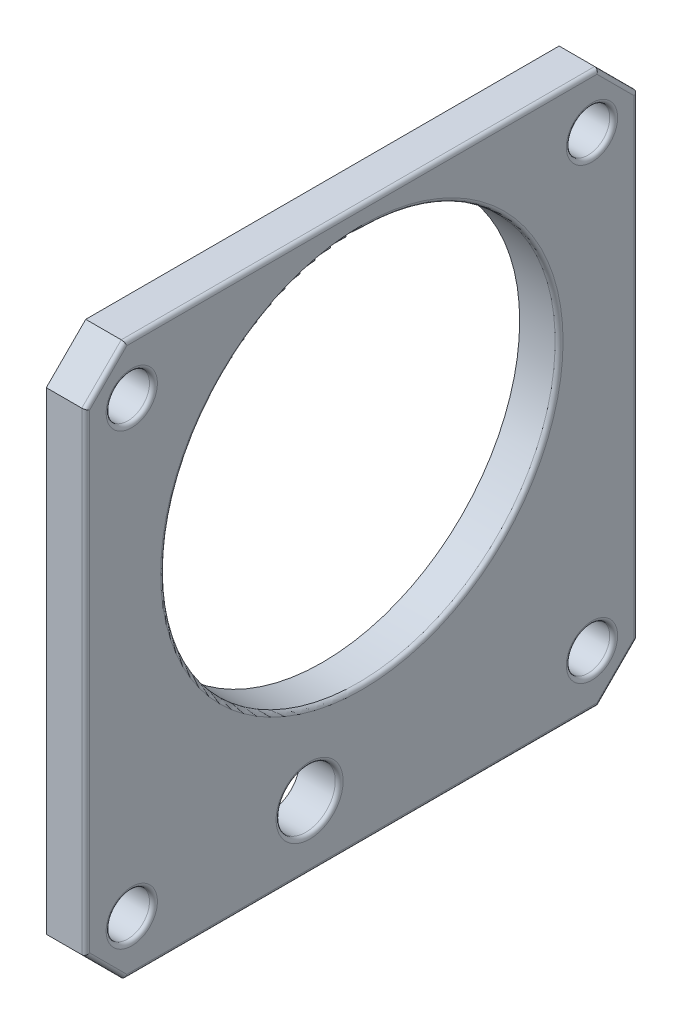
ISO-10303-21;
HEADER;
FILE_DESCRIPTION(('STEP AP214'),'2;1');
FILE_NAME('part.step','',(''),(''),'','','');
FILE_SCHEMA(('AUTOMOTIVE_DESIGN { 1 0 10303 214 1 1 1 1 }'));
ENDSEC;
DATA;
#1=APPLICATION_CONTEXT('core data for automotive mechanical design processes');
#2=APPLICATION_PROTOCOL_DEFINITION('international standard','automotive_design',2000,#1);
#3=PRODUCT_CONTEXT('',#1,'mechanical');
#4=PRODUCT('Part','Part','',(#3));
#5=PRODUCT_RELATED_PRODUCT_CATEGORY('part','',(#4));
#6=PRODUCT_DEFINITION_FORMATION('','',#4);
#7=PRODUCT_DEFINITION_CONTEXT('part definition',#1,'design');
#8=PRODUCT_DEFINITION('design','',#6,#7);
#9=PRODUCT_DEFINITION_SHAPE('','',#8);
#10=(LENGTH_UNIT() NAMED_UNIT(*) SI_UNIT(.MILLI.,.METRE.));
#11=(NAMED_UNIT(*) PLANE_ANGLE_UNIT() SI_UNIT($,.RADIAN.));
#12=(NAMED_UNIT(*) SI_UNIT($,.STERADIAN.) SOLID_ANGLE_UNIT());
#13=UNCERTAINTY_MEASURE_WITH_UNIT(LENGTH_MEASURE(1.E-05),#10,'distance_accuracy_value','');
#14=(GEOMETRIC_REPRESENTATION_CONTEXT(3) GLOBAL_UNCERTAINTY_ASSIGNED_CONTEXT((#13)) GLOBAL_UNIT_ASSIGNED_CONTEXT((#10,
#11,#12)) REPRESENTATION_CONTEXT('',''));
#15=CARTESIAN_POINT('',(0.,0.,0.));
#16=DIRECTION('',(0.,0.,1.));
#17=DIRECTION('',(1.,0.,0.));
#18=AXIS2_PLACEMENT_3D('',#15,#16,#17);
#19=CARTESIAN_POINT('',(3.,0.,0.));
#20=DIRECTION('',(-1.,0.,0.));
#21=DIRECTION('',(0.,0.,1.));
#22=AXIS2_PLACEMENT_3D('',#19,#20,#21);
#23=PLANE('',#22);
#24=CARTESIAN_POINT('',(3.,4.40000000000001,0.));
#25=DIRECTION('',(-1.,0.,0.));
#26=DIRECTION('',(0.,0.,1.));
#27=AXIS2_PLACEMENT_3D('',#24,#25,#26);
#28=CIRCLE('',#27,15.3);
#29=CARTESIAN_POINT('',(3.,4.40000000000001,15.3));
#30=VERTEX_POINT('',#29);
#31=EDGE_CURVE('E230',#30,#30,#28,.T.);
#32=ORIENTED_EDGE('',*,*,#31,.T.);
#33=EDGE_LOOP('',(#32));
#34=FACE_BOUND('',#33,.T.);
#35=DIRECTION('',(0.,1.,0.));
#36=VECTOR('',#35,1.);
#37=CARTESIAN_POINT('',(3.,0.,-20.7));
#38=LINE('',#37,#36);
#39=CARTESIAN_POINT('',(3.,-17.8757359312881,-20.7));
#40=VERTEX_POINT('',#39);
#41=CARTESIAN_POINT('',(3.,17.8757359312881,-20.7));
#42=VERTEX_POINT('',#41);
#43=EDGE_CURVE('E225',#40,#42,#38,.T.);
#44=ORIENTED_EDGE('',*,*,#43,.T.);
#45=DIRECTION('',(0.,0.707106781186548,0.707106781186547));
#46=VECTOR('',#45,1.);
#47=CARTESIAN_POINT('',(3.,19.287867965644,-19.2878679656441));
#48=LINE('',#47,#46);
#49=CARTESIAN_POINT('',(3.,20.7,-17.8757359312881));
#50=VERTEX_POINT('',#49);
#51=EDGE_CURVE('E227',#42,#50,#48,.T.);
#52=ORIENTED_EDGE('',*,*,#51,.T.);
#53=DIRECTION('',(0.,0.,1.));
#54=VECTOR('',#53,1.);
#55=CARTESIAN_POINT('',(3.,20.7,0.));
#56=LINE('',#55,#54);
#57=CARTESIAN_POINT('',(3.,20.7,17.8757359312881));
#58=VERTEX_POINT('',#57);
#59=EDGE_CURVE('E213',#50,#58,#56,.T.);
#60=ORIENTED_EDGE('',*,*,#59,.T.);
#61=DIRECTION('',(0.,-0.707106781186548,0.707106781186548));
#62=VECTOR('',#61,1.);
#63=CARTESIAN_POINT('',(3.,19.287867965644,19.287867965644));
#64=LINE('',#63,#62);
#65=CARTESIAN_POINT('',(3.,17.8757359312881,20.7));
#66=VERTEX_POINT('',#65);
#67=EDGE_CURVE('E215',#58,#66,#64,.T.);
#68=ORIENTED_EDGE('',*,*,#67,.T.);
#69=DIRECTION('',(0.,-1.,0.));
#70=VECTOR('',#69,1.);
#71=CARTESIAN_POINT('',(3.,0.,20.7));
#72=LINE('',#71,#70);
#73=CARTESIAN_POINT('',(3.,-17.8757359312881,20.7));
#74=VERTEX_POINT('',#73);
#75=EDGE_CURVE('E217',#66,#74,#72,.T.);
#76=ORIENTED_EDGE('',*,*,#75,.T.);
#77=DIRECTION('',(0.,-0.707106781186548,-0.707106781186547));
#78=VECTOR('',#77,1.);
#79=CARTESIAN_POINT('',(3.,-19.287867965644,19.2878679656441));
#80=LINE('',#79,#78);
#81=CARTESIAN_POINT('',(3.,-20.7,17.8757359312881));
#82=VERTEX_POINT('',#81);
#83=EDGE_CURVE('E219',#74,#82,#80,.T.);
#84=ORIENTED_EDGE('',*,*,#83,.T.);
#85=DIRECTION('',(0.,0.,-1.));
#86=VECTOR('',#85,1.);
#87=CARTESIAN_POINT('',(3.,-20.7,0.));
#88=LINE('',#87,#86);
#89=CARTESIAN_POINT('',(3.,-20.7,-17.8757359312881));
#90=VERTEX_POINT('',#89);
#91=EDGE_CURVE('E221',#82,#90,#88,.T.);
#92=ORIENTED_EDGE('',*,*,#91,.T.);
#93=DIRECTION('',(0.,0.707106781186548,-0.707106781186548));
#94=VECTOR('',#93,1.);
#95=CARTESIAN_POINT('',(3.,-19.287867965644,-19.287867965644));
#96=LINE('',#95,#94);
#97=EDGE_CURVE('E223',#90,#40,#96,.T.);
#98=ORIENTED_EDGE('',*,*,#97,.T.);
#99=EDGE_LOOP('',(#44,#52,#60,#68,#76,#84,#92,#98));
#100=FACE_BOUND('',#99,.T.);
#101=CARTESIAN_POINT('',(3.,-17.0620447832832,-17.4995034759885));
#102=DIRECTION('',(-1.,0.,0.));
#103=DIRECTION('',(0.,0.,1.));
#104=AXIS2_PLACEMENT_3D('',#101,#102,#103);
#105=CIRCLE('',#104,1.95);
#106=CARTESIAN_POINT('',(3.,-17.0620447832832,-15.5495034759885));
#107=VERTEX_POINT('',#106);
#108=EDGE_CURVE('E210',#107,#107,#105,.T.);
#109=ORIENTED_EDGE('',*,*,#108,.T.);
#110=EDGE_LOOP('',(#109));
#111=FACE_BOUND('',#110,.T.);
#112=CARTESIAN_POINT('',(3.,17.0620447832832,17.4995034759885));
#113=DIRECTION('',(-1.,0.,0.));
#114=DIRECTION('',(0.,0.,1.));
#115=AXIS2_PLACEMENT_3D('',#112,#113,#114);
#116=CIRCLE('',#115,1.95);
#117=CARTESIAN_POINT('',(3.,17.0620447832832,19.4495034759885));
#118=VERTEX_POINT('',#117);
#119=EDGE_CURVE('E207',#118,#118,#116,.T.);
#120=ORIENTED_EDGE('',*,*,#119,.T.);
#121=EDGE_LOOP('',(#120));
#122=FACE_BOUND('',#121,.T.);
#123=CARTESIAN_POINT('',(3.,17.0620447832832,-17.4995034759885));
#124=DIRECTION('',(-1.,0.,0.));
#125=DIRECTION('',(0.,0.,1.));
#126=AXIS2_PLACEMENT_3D('',#123,#124,#125);
#127=CIRCLE('',#126,1.95);
#128=CARTESIAN_POINT('',(3.,17.0620447832832,-15.5495034759885));
#129=VERTEX_POINT('',#128);
#130=EDGE_CURVE('E204',#129,#129,#127,.T.);
#131=ORIENTED_EDGE('',*,*,#130,.T.);
#132=EDGE_LOOP('',(#131));
#133=FACE_BOUND('',#132,.T.);
#134=CARTESIAN_POINT('',(3.,-17.0620447832832,17.4995034759885));
#135=DIRECTION('',(-1.,0.,0.));
#136=DIRECTION('',(0.,0.,1.));
#137=AXIS2_PLACEMENT_3D('',#134,#135,#136);
#138=CIRCLE('',#137,1.95);
#139=CARTESIAN_POINT('',(3.,-17.0620447832832,19.4495034759885));
#140=VERTEX_POINT('',#139);
#141=EDGE_CURVE('E201',#140,#140,#138,.T.);
#142=ORIENTED_EDGE('',*,*,#141,.T.);
#143=EDGE_LOOP('',(#142));
#144=FACE_BOUND('',#143,.T.);
#145=CARTESIAN_POINT('',(3.,-16.2,3.97497152615893));
#146=DIRECTION('',(-1.,0.,0.));
#147=DIRECTION('',(0.,0.,1.));
#148=AXIS2_PLACEMENT_3D('',#145,#146,#147);
#149=CIRCLE('',#148,2.55);
#150=CARTESIAN_POINT('',(3.,-16.2,6.52497152615894));
#151=VERTEX_POINT('',#150);
#152=EDGE_CURVE('E198',#151,#151,#149,.T.);
#153=ORIENTED_EDGE('',*,*,#152,.T.);
#154=EDGE_LOOP('',(#153));
#155=FACE_BOUND('',#154,.T.);
#156=ADVANCED_FACE('F35',(#34,#100,#111,#122,#133,#144,#155),#23,.F.);
#157=CARTESIAN_POINT('',(0.,0.,0.));
#158=DIRECTION('',(-1.,0.,0.));
#159=DIRECTION('',(0.,0.,1.));
#160=AXIS2_PLACEMENT_3D('',#157,#158,#159);
#161=PLANE('',#160);
#162=CARTESIAN_POINT('',(0.,-16.2,3.97497152615893));
#163=DIRECTION('',(-1.,0.,0.));
#164=DIRECTION('',(0.,0.,1.));
#165=AXIS2_PLACEMENT_3D('',#162,#163,#164);
#166=CIRCLE('',#165,2.25);
#167=CARTESIAN_POINT('',(0.,-16.2,6.22497152615894));
#168=VERTEX_POINT('',#167);
#169=EDGE_CURVE('E188',#168,#168,#166,.T.);
#170=ORIENTED_EDGE('',*,*,#169,.F.);
#171=EDGE_LOOP('',(#170));
#172=FACE_BOUND('',#171,.T.);
#173=CARTESIAN_POINT('',(0.,-17.0620447832832,17.4995034759885));
#174=DIRECTION('',(-1.,0.,0.));
#175=DIRECTION('',(0.,0.,1.));
#176=AXIS2_PLACEMENT_3D('',#173,#174,#175);
#177=CIRCLE('',#176,1.65);
#178=CARTESIAN_POINT('',(0.,-17.0620447832832,19.1495034759885));
#179=VERTEX_POINT('',#178);
#180=EDGE_CURVE('E153',#179,#179,#177,.T.);
#181=ORIENTED_EDGE('',*,*,#180,.F.);
#182=EDGE_LOOP('',(#181));
#183=FACE_BOUND('',#182,.T.);
#184=CARTESIAN_POINT('',(0.,17.0620447832832,-17.4995034759885));
#185=DIRECTION('',(-1.,0.,0.));
#186=DIRECTION('',(0.,0.,1.));
#187=AXIS2_PLACEMENT_3D('',#184,#185,#186);
#188=CIRCLE('',#187,1.65);
#189=CARTESIAN_POINT('',(0.,17.0620447832832,-15.8495034759885));
#190=VERTEX_POINT('',#189);
#191=EDGE_CURVE('E191',#190,#190,#188,.T.);
#192=ORIENTED_EDGE('',*,*,#191,.F.);
#193=EDGE_LOOP('',(#192));
#194=FACE_BOUND('',#193,.T.);
#195=CARTESIAN_POINT('',(0.,17.0620447832832,17.4995034759885));
#196=DIRECTION('',(-1.,0.,0.));
#197=DIRECTION('',(0.,0.,1.));
#198=AXIS2_PLACEMENT_3D('',#195,#196,#197);
#199=CIRCLE('',#198,1.65);
#200=CARTESIAN_POINT('',(0.,17.0620447832832,19.1495034759885));
#201=VERTEX_POINT('',#200);
#202=EDGE_CURVE('E187',#201,#201,#199,.T.);
#203=ORIENTED_EDGE('',*,*,#202,.F.);
#204=EDGE_LOOP('',(#203));
#205=FACE_BOUND('',#204,.T.);
#206=CARTESIAN_POINT('',(0.,-17.0620447832832,-17.4995034759885));
#207=DIRECTION('',(-1.,0.,0.));
#208=DIRECTION('',(0.,0.,1.));
#209=AXIS2_PLACEMENT_3D('',#206,#207,#208);
#210=CIRCLE('',#209,1.65);
#211=CARTESIAN_POINT('',(0.,-17.0620447832832,-15.8495034759885));
#212=VERTEX_POINT('',#211);
#213=EDGE_CURVE('E184',#212,#212,#210,.T.);
#214=ORIENTED_EDGE('',*,*,#213,.F.);
#215=EDGE_LOOP('',(#214));
#216=FACE_BOUND('',#215,.T.);
#217=DIRECTION('',(0.,0.,1.));
#218=VECTOR('',#217,1.);
#219=CARTESIAN_POINT('',(0.,21.,18.));
#220=LINE('',#219,#218);
#221=CARTESIAN_POINT('',(0.,21.,-18.));
#222=VERTEX_POINT('',#221);
#223=CARTESIAN_POINT('',(0.,21.,18.));
#224=VERTEX_POINT('',#223);
#225=EDGE_CURVE('E141',#222,#224,#220,.T.);
#226=ORIENTED_EDGE('',*,*,#225,.F.);
#227=DIRECTION('',(0.,0.707106781186548,0.707106781186547));
#228=VECTOR('',#227,1.);
#229=CARTESIAN_POINT('',(0.,21.,-18.));
#230=LINE('',#229,#228);
#231=CARTESIAN_POINT('',(0.,18.,-21.));
#232=VERTEX_POINT('',#231);
#233=EDGE_CURVE('E170',#232,#222,#230,.T.);
#234=ORIENTED_EDGE('',*,*,#233,.F.);
#235=DIRECTION('',(0.,1.,0.));
#236=VECTOR('',#235,1.);
#237=CARTESIAN_POINT('',(0.,18.,-21.));
#238=LINE('',#237,#236);
#239=CARTESIAN_POINT('',(0.,-18.,-21.));
#240=VERTEX_POINT('',#239);
#241=EDGE_CURVE('E167',#240,#232,#238,.T.);
#242=ORIENTED_EDGE('',*,*,#241,.F.);
#243=DIRECTION('',(0.,0.707106781186548,-0.707106781186548));
#244=VECTOR('',#243,1.);
#245=CARTESIAN_POINT('',(0.,-21.,-18.));
#246=LINE('',#245,#244);
#247=CARTESIAN_POINT('',(0.,-21.,-18.));
#248=VERTEX_POINT('',#247);
#249=EDGE_CURVE('E164',#248,#240,#246,.T.);
#250=ORIENTED_EDGE('',*,*,#249,.F.);
#251=DIRECTION('',(0.,0.,-1.));
#252=VECTOR('',#251,1.);
#253=CARTESIAN_POINT('',(0.,-21.,18.));
#254=LINE('',#253,#252);
#255=CARTESIAN_POINT('',(0.,-21.,18.));
#256=VERTEX_POINT('',#255);
#257=EDGE_CURVE('E161',#256,#248,#254,.T.);
#258=ORIENTED_EDGE('',*,*,#257,.F.);
#259=DIRECTION('',(0.,-0.707106781186548,-0.707106781186547));
#260=VECTOR('',#259,1.);
#261=CARTESIAN_POINT('',(0.,-18.,21.));
#262=LINE('',#261,#260);
#263=CARTESIAN_POINT('',(0.,-18.,21.));
#264=VERTEX_POINT('',#263);
#265=EDGE_CURVE('E158',#264,#256,#262,.T.);
#266=ORIENTED_EDGE('',*,*,#265,.F.);
#267=DIRECTION('',(0.,-1.,0.));
#268=VECTOR('',#267,1.);
#269=CARTESIAN_POINT('',(0.,18.,21.));
#270=LINE('',#269,#268);
#271=CARTESIAN_POINT('',(0.,18.,21.));
#272=VERTEX_POINT('',#271);
#273=EDGE_CURVE('E144',#272,#264,#270,.T.);
#274=ORIENTED_EDGE('',*,*,#273,.F.);
#275=DIRECTION('',(0.,-0.707106781186548,0.707106781186548));
#276=VECTOR('',#275,1.);
#277=CARTESIAN_POINT('',(0.,18.,21.));
#278=LINE('',#277,#276);
#279=EDGE_CURVE('E128',#224,#272,#278,.T.);
#280=ORIENTED_EDGE('',*,*,#279,.F.);
#281=EDGE_LOOP('',(#226,#234,#242,#250,#258,#266,#274,#280));
#282=FACE_BOUND('',#281,.T.);
#283=CARTESIAN_POINT('',(0.,4.40000000000001,0.));
#284=DIRECTION('',(1.,0.,0.));
#285=DIRECTION('',(0.,0.,-1.));
#286=AXIS2_PLACEMENT_3D('',#283,#284,#285);
#287=CIRCLE('',#286,15.);
#288=CARTESIAN_POINT('',(0.,4.40000000000001,-15.));
#289=VERTEX_POINT('',#288);
#290=EDGE_CURVE('E150',#289,#289,#287,.T.);
#291=ORIENTED_EDGE('',*,*,#290,.T.);
#292=EDGE_LOOP('',(#291));
#293=FACE_BOUND('',#292,.T.);
#294=ADVANCED_FACE('F138',(#172,#183,#194,#205,#216,#282,#293),#161,.T.);
#295=CARTESIAN_POINT('',(3.,21.,18.));
#296=DIRECTION('',(0.,-1.,0.));
#297=DIRECTION('',(0.,0.,-1.));
#298=AXIS2_PLACEMENT_3D('',#295,#296,#297);
#299=PLANE('',#298);
#300=DIRECTION('',(-1.,0.,0.));
#301=VECTOR('',#300,1.);
#302=CARTESIAN_POINT('',(3.,21.,18.));
#303=LINE('',#302,#301);
#304=CARTESIAN_POINT('',(2.7,21.,18.));
#305=VERTEX_POINT('',#304);
#306=EDGE_CURVE('E125',#305,#224,#303,.T.);
#307=ORIENTED_EDGE('',*,*,#306,.F.);
#308=DIRECTION('',(0.,0.,1.));
#309=VECTOR('',#308,1.);
#310=CARTESIAN_POINT('',(2.7,21.,18.));
#311=LINE('',#310,#309);
#312=CARTESIAN_POINT('',(2.7,21.,-18.));
#313=VERTEX_POINT('',#312);
#314=EDGE_CURVE('E246',#305,#313,#311,.F.);
#315=ORIENTED_EDGE('',*,*,#314,.T.);
#316=DIRECTION('',(-1.,0.,0.));
#317=VECTOR('',#316,1.);
#318=CARTESIAN_POINT('',(3.,21.,-18.));
#319=LINE('',#318,#317);
#320=EDGE_CURVE('E148',#313,#222,#319,.T.);
#321=ORIENTED_EDGE('',*,*,#320,.T.);
#322=ORIENTED_EDGE('',*,*,#225,.T.);
#323=EDGE_LOOP('',(#307,#315,#321,#322));
#324=FACE_BOUND('',#323,.T.);
#325=ADVANCED_FACE('F146',(#324),#299,.F.);
#326=CARTESIAN_POINT('',(3.,18.,21.));
#327=DIRECTION('',(0.,-0.707106781186547,-0.707106781186547));
#328=DIRECTION('',(0.,0.707106781186548,-0.707106781186548));
#329=AXIS2_PLACEMENT_3D('',#326,#327,#328);
#330=PLANE('',#329);
#331=DIRECTION('',(-1.,0.,0.));
#332=VECTOR('',#331,1.);
#333=CARTESIAN_POINT('',(3.,18.,21.));
#334=LINE('',#333,#332);
#335=CARTESIAN_POINT('',(2.7,18.,21.));
#336=VERTEX_POINT('',#335);
#337=EDGE_CURVE('E134',#336,#272,#334,.T.);
#338=ORIENTED_EDGE('',*,*,#337,.F.);
#339=DIRECTION('',(0.,-0.707106781186548,0.707106781186548));
#340=VECTOR('',#339,1.);
#341=CARTESIAN_POINT('',(2.7,18.,21.));
#342=LINE('',#341,#340);
#343=EDGE_CURVE('E52',#336,#305,#342,.F.);
#344=ORIENTED_EDGE('',*,*,#343,.T.);
#345=ORIENTED_EDGE('',*,*,#306,.T.);
#346=ORIENTED_EDGE('',*,*,#279,.T.);
#347=EDGE_LOOP('',(#338,#344,#345,#346));
#348=FACE_BOUND('',#347,.T.);
#349=ADVANCED_FACE('F127',(#348),#330,.F.);
#350=CARTESIAN_POINT('',(3.,18.,21.));
#351=DIRECTION('',(0.,0.,-1.));
#352=DIRECTION('',(0.,1.,0.));
#353=AXIS2_PLACEMENT_3D('',#350,#351,#352);
#354=PLANE('',#353);
#355=DIRECTION('',(-1.,0.,0.));
#356=VECTOR('',#355,1.);
#357=CARTESIAN_POINT('',(3.,-18.,21.));
#358=LINE('',#357,#356);
#359=CARTESIAN_POINT('',(2.7,-18.,21.));
#360=VERTEX_POINT('',#359);
#361=EDGE_CURVE('E181',#360,#264,#358,.T.);
#362=ORIENTED_EDGE('',*,*,#361,.F.);
#363=DIRECTION('',(0.,-1.,0.));
#364=VECTOR('',#363,1.);
#365=CARTESIAN_POINT('',(2.7,18.,21.));
#366=LINE('',#365,#364);
#367=EDGE_CURVE('E60',#360,#336,#366,.F.);
#368=ORIENTED_EDGE('',*,*,#367,.T.);
#369=ORIENTED_EDGE('',*,*,#337,.T.);
#370=ORIENTED_EDGE('',*,*,#273,.T.);
#371=EDGE_LOOP('',(#362,#368,#369,#370));
#372=FACE_BOUND('',#371,.T.);
#373=ADVANCED_FACE('F342',(#372),#354,.F.);
#374=CARTESIAN_POINT('',(3.,-18.,21.));
#375=DIRECTION('',(0.,0.707106781186547,-0.707106781186548));
#376=DIRECTION('',(0.,0.707106781186548,0.707106781186547));
#377=AXIS2_PLACEMENT_3D('',#374,#375,#376);
#378=PLANE('',#377);
#379=DIRECTION('',(-1.,0.,0.));
#380=VECTOR('',#379,1.);
#381=CARTESIAN_POINT('',(3.,-21.,18.));
#382=LINE('',#381,#380);
#383=CARTESIAN_POINT('',(2.7,-21.,18.));
#384=VERTEX_POINT('',#383);
#385=EDGE_CURVE('E179',#384,#256,#382,.T.);
#386=ORIENTED_EDGE('',*,*,#385,.F.);
#387=DIRECTION('',(0.,-0.707106781186548,-0.707106781186547));
#388=VECTOR('',#387,1.);
#389=CARTESIAN_POINT('',(2.7,-18.,21.));
#390=LINE('',#389,#388);
#391=EDGE_CURVE('E242',#384,#360,#390,.F.);
#392=ORIENTED_EDGE('',*,*,#391,.T.);
#393=ORIENTED_EDGE('',*,*,#361,.T.);
#394=ORIENTED_EDGE('',*,*,#265,.T.);
#395=EDGE_LOOP('',(#386,#392,#393,#394));
#396=FACE_BOUND('',#395,.T.);
#397=ADVANCED_FACE('F338',(#396),#378,.F.);
#398=CARTESIAN_POINT('',(3.,-21.,18.));
#399=DIRECTION('',(0.,1.,0.));
#400=DIRECTION('',(0.,0.,1.));
#401=AXIS2_PLACEMENT_3D('',#398,#399,#400);
#402=PLANE('',#401);
#403=DIRECTION('',(-1.,0.,0.));
#404=VECTOR('',#403,1.);
#405=CARTESIAN_POINT('',(3.,-21.,-18.));
#406=LINE('',#405,#404);
#407=CARTESIAN_POINT('',(2.7,-21.,-18.));
#408=VERTEX_POINT('',#407);
#409=EDGE_CURVE('E177',#408,#248,#406,.T.);
#410=ORIENTED_EDGE('',*,*,#409,.F.);
#411=DIRECTION('',(0.,0.,-1.));
#412=VECTOR('',#411,1.);
#413=CARTESIAN_POINT('',(2.7,-21.,18.));
#414=LINE('',#413,#412);
#415=EDGE_CURVE('E240',#408,#384,#414,.F.);
#416=ORIENTED_EDGE('',*,*,#415,.T.);
#417=ORIENTED_EDGE('',*,*,#385,.T.);
#418=ORIENTED_EDGE('',*,*,#257,.T.);
#419=EDGE_LOOP('',(#410,#416,#417,#418));
#420=FACE_BOUND('',#419,.T.);
#421=ADVANCED_FACE('F334',(#420),#402,.F.);
#422=CARTESIAN_POINT('',(3.,-21.,-18.));
#423=DIRECTION('',(0.,0.707106781186547,0.707106781186547));
#424=DIRECTION('',(0.,-0.707106781186548,0.707106781186548));
#425=AXIS2_PLACEMENT_3D('',#422,#423,#424);
#426=PLANE('',#425);
#427=DIRECTION('',(-1.,0.,0.));
#428=VECTOR('',#427,1.);
#429=CARTESIAN_POINT('',(3.,-18.,-21.));
#430=LINE('',#429,#428);
#431=CARTESIAN_POINT('',(2.7,-18.,-21.));
#432=VERTEX_POINT('',#431);
#433=EDGE_CURVE('E175',#432,#240,#430,.T.);
#434=ORIENTED_EDGE('',*,*,#433,.F.);
#435=DIRECTION('',(0.,0.707106781186548,-0.707106781186548));
#436=VECTOR('',#435,1.);
#437=CARTESIAN_POINT('',(2.7,-21.,-18.));
#438=LINE('',#437,#436);
#439=EDGE_CURVE('E238',#432,#408,#438,.F.);
#440=ORIENTED_EDGE('',*,*,#439,.T.);
#441=ORIENTED_EDGE('',*,*,#409,.T.);
#442=ORIENTED_EDGE('',*,*,#249,.T.);
#443=EDGE_LOOP('',(#434,#440,#441,#442));
#444=FACE_BOUND('',#443,.T.);
#445=ADVANCED_FACE('F330',(#444),#426,.F.);
#446=CARTESIAN_POINT('',(3.,18.,-21.));
#447=DIRECTION('',(0.,0.,1.));
#448=DIRECTION('',(0.,-1.,0.));
#449=AXIS2_PLACEMENT_3D('',#446,#447,#448);
#450=PLANE('',#449);
#451=DIRECTION('',(-1.,0.,0.));
#452=VECTOR('',#451,1.);
#453=CARTESIAN_POINT('',(3.,18.,-21.));
#454=LINE('',#453,#452);
#455=CARTESIAN_POINT('',(2.7,18.,-21.));
#456=VERTEX_POINT('',#455);
#457=EDGE_CURVE('E173',#456,#232,#454,.T.);
#458=ORIENTED_EDGE('',*,*,#457,.F.);
#459=DIRECTION('',(0.,1.,0.));
#460=VECTOR('',#459,1.);
#461=CARTESIAN_POINT('',(2.7,18.,-21.));
#462=LINE('',#461,#460);
#463=EDGE_CURVE('E236',#456,#432,#462,.F.);
#464=ORIENTED_EDGE('',*,*,#463,.T.);
#465=ORIENTED_EDGE('',*,*,#433,.T.);
#466=ORIENTED_EDGE('',*,*,#241,.T.);
#467=EDGE_LOOP('',(#458,#464,#465,#466));
#468=FACE_BOUND('',#467,.T.);
#469=ADVANCED_FACE('F326',(#468),#450,.F.);
#470=CARTESIAN_POINT('',(3.,21.,-18.));
#471=DIRECTION('',(0.,-0.707106781186547,0.707106781186548));
#472=DIRECTION('',(0.,-0.707106781186548,-0.707106781186547));
#473=AXIS2_PLACEMENT_3D('',#470,#471,#472);
#474=PLANE('',#473);
#475=ORIENTED_EDGE('',*,*,#320,.F.);
#476=DIRECTION('',(0.,0.707106781186548,0.707106781186547));
#477=VECTOR('',#476,1.);
#478=CARTESIAN_POINT('',(2.7,21.,-18.));
#479=LINE('',#478,#477);
#480=EDGE_CURVE('E233',#313,#456,#479,.F.);
#481=ORIENTED_EDGE('',*,*,#480,.T.);
#482=ORIENTED_EDGE('',*,*,#457,.T.);
#483=ORIENTED_EDGE('',*,*,#233,.T.);
#484=EDGE_LOOP('',(#475,#481,#482,#483));
#485=FACE_BOUND('',#484,.T.);
#486=ADVANCED_FACE('F313',(#485),#474,.F.);
#487=CARTESIAN_POINT('',(3.,4.40000000000001,0.));
#488=DIRECTION('',(-1.,0.,0.));
#489=DIRECTION('',(0.,0.,1.));
#490=AXIS2_PLACEMENT_3D('',#487,#488,#489);
#491=CYLINDRICAL_SURFACE('',#490,15.);
#492=CARTESIAN_POINT('',(2.7,4.40000000000001,0.));
#493=DIRECTION('',(-1.,0.,0.));
#494=DIRECTION('',(0.,0.,1.));
#495=AXIS2_PLACEMENT_3D('',#492,#493,#494);
#496=CIRCLE('',#495,15.);
#497=CARTESIAN_POINT('',(2.7,4.40000000000001,15.));
#498=VERTEX_POINT('',#497);
#499=EDGE_CURVE('E133',#498,#498,#496,.F.);
#500=ORIENTED_EDGE('',*,*,#499,.T.);
#501=EDGE_LOOP('',(#500));
#502=FACE_BOUND('',#501,.T.);
#503=ORIENTED_EDGE('',*,*,#290,.F.);
#504=EDGE_LOOP('',(#503));
#505=FACE_BOUND('',#504,.T.);
#506=ADVANCED_FACE('F303',(#502,#505),#491,.F.);
#507=CARTESIAN_POINT('',(3.,-17.0620447832832,-17.4995034759885));
#508=DIRECTION('',(-1.,0.,0.));
#509=DIRECTION('',(0.,0.,1.));
#510=AXIS2_PLACEMENT_3D('',#507,#508,#509);
#511=CYLINDRICAL_SURFACE('',#510,1.65);
#512=CARTESIAN_POINT('',(2.7,-17.0620447832832,-17.4995034759885));
#513=DIRECTION('',(-1.,0.,0.));
#514=DIRECTION('',(0.,0.,1.));
#515=AXIS2_PLACEMENT_3D('',#512,#513,#514);
#516=CIRCLE('',#515,1.65);
#517=CARTESIAN_POINT('',(2.7,-17.0620447832832,-15.8495034759885));
#518=VERTEX_POINT('',#517);
#519=EDGE_CURVE('E248',#518,#518,#516,.F.);
#520=ORIENTED_EDGE('',*,*,#519,.T.);
#521=EDGE_LOOP('',(#520));
#522=FACE_BOUND('',#521,.T.);
#523=ORIENTED_EDGE('',*,*,#213,.T.);
#524=EDGE_LOOP('',(#523));
#525=FACE_BOUND('',#524,.T.);
#526=ADVANCED_FACE('F300',(#522,#525),#511,.F.);
#527=CARTESIAN_POINT('',(3.,17.0620447832832,17.4995034759885));
#528=DIRECTION('',(-1.,0.,0.));
#529=DIRECTION('',(0.,0.,1.));
#530=AXIS2_PLACEMENT_3D('',#527,#528,#529);
#531=CYLINDRICAL_SURFACE('',#530,1.65);
#532=CARTESIAN_POINT('',(2.7,17.0620447832832,17.4995034759885));
#533=DIRECTION('',(-1.,0.,0.));
#534=DIRECTION('',(0.,0.,1.));
#535=AXIS2_PLACEMENT_3D('',#532,#533,#534);
#536=CIRCLE('',#535,1.65);
#537=CARTESIAN_POINT('',(2.7,17.0620447832832,19.1495034759885));
#538=VERTEX_POINT('',#537);
#539=EDGE_CURVE('E251',#538,#538,#536,.F.);
#540=ORIENTED_EDGE('',*,*,#539,.T.);
#541=EDGE_LOOP('',(#540));
#542=FACE_BOUND('',#541,.T.);
#543=ORIENTED_EDGE('',*,*,#202,.T.);
#544=EDGE_LOOP('',(#543));
#545=FACE_BOUND('',#544,.T.);
#546=ADVANCED_FACE('F302',(#542,#545),#531,.F.);
#547=CARTESIAN_POINT('',(3.,17.0620447832832,-17.4995034759885));
#548=DIRECTION('',(-1.,0.,0.));
#549=DIRECTION('',(0.,0.,1.));
#550=AXIS2_PLACEMENT_3D('',#547,#548,#549);
#551=CYLINDRICAL_SURFACE('',#550,1.65);
#552=CARTESIAN_POINT('',(2.7,17.0620447832832,-17.4995034759885));
#553=DIRECTION('',(-1.,0.,0.));
#554=DIRECTION('',(0.,0.,1.));
#555=AXIS2_PLACEMENT_3D('',#552,#553,#554);
#556=CIRCLE('',#555,1.65);
#557=CARTESIAN_POINT('',(2.7,17.0620447832832,-15.8495034759885));
#558=VERTEX_POINT('',#557);
#559=EDGE_CURVE('E254',#558,#558,#556,.F.);
#560=ORIENTED_EDGE('',*,*,#559,.T.);
#561=EDGE_LOOP('',(#560));
#562=FACE_BOUND('',#561,.T.);
#563=ORIENTED_EDGE('',*,*,#191,.T.);
#564=EDGE_LOOP('',(#563));
#565=FACE_BOUND('',#564,.T.);
#566=ADVANCED_FACE('F310',(#562,#565),#551,.F.);
#567=CARTESIAN_POINT('',(3.,-17.0620447832832,17.4995034759885));
#568=DIRECTION('',(-1.,0.,0.));
#569=DIRECTION('',(0.,0.,1.));
#570=AXIS2_PLACEMENT_3D('',#567,#568,#569);
#571=CYLINDRICAL_SURFACE('',#570,1.65);
#572=CARTESIAN_POINT('',(2.7,-17.0620447832832,17.4995034759885));
#573=DIRECTION('',(-1.,0.,0.));
#574=DIRECTION('',(0.,0.,1.));
#575=AXIS2_PLACEMENT_3D('',#572,#573,#574);
#576=CIRCLE('',#575,1.65);
#577=CARTESIAN_POINT('',(2.7,-17.0620447832832,19.1495034759885));
#578=VERTEX_POINT('',#577);
#579=EDGE_CURVE('E44',#578,#578,#576,.F.);
#580=ORIENTED_EDGE('',*,*,#579,.T.);
#581=EDGE_LOOP('',(#580));
#582=FACE_BOUND('',#581,.T.);
#583=ORIENTED_EDGE('',*,*,#180,.T.);
#584=EDGE_LOOP('',(#583));
#585=FACE_BOUND('',#584,.T.);
#586=ADVANCED_FACE('F410',(#582,#585),#571,.F.);
#587=CARTESIAN_POINT('',(3.,-16.2,3.97497152615893));
#588=DIRECTION('',(-1.,0.,0.));
#589=DIRECTION('',(0.,0.,1.));
#590=AXIS2_PLACEMENT_3D('',#587,#588,#589);
#591=CYLINDRICAL_SURFACE('',#590,2.25);
#592=CARTESIAN_POINT('',(2.7,-16.2,3.97497152615893));
#593=DIRECTION('',(-1.,0.,0.));
#594=DIRECTION('',(0.,0.,1.));
#595=AXIS2_PLACEMENT_3D('',#592,#593,#594);
#596=CIRCLE('',#595,2.25);
#597=CARTESIAN_POINT('',(2.7,-16.2,6.22497152615894));
#598=VERTEX_POINT('',#597);
#599=EDGE_CURVE('E11',#598,#598,#596,.F.);
#600=ORIENTED_EDGE('',*,*,#599,.T.);
#601=EDGE_LOOP('',(#600));
#602=FACE_BOUND('',#601,.T.);
#603=ORIENTED_EDGE('',*,*,#169,.T.);
#604=EDGE_LOOP('',(#603));
#605=FACE_BOUND('',#604,.T.);
#606=ADVANCED_FACE('F287',(#602,#605),#591,.F.);
#607=CARTESIAN_POINT('',(2.7,4.40000000000001,0.));
#608=DIRECTION('',(-1.,0.,0.));
#609=DIRECTION('',(0.,0.,1.));
#610=AXIS2_PLACEMENT_3D('',#607,#608,#609);
#611=TOROIDAL_SURFACE('',#610,15.3,0.3);
#612=ORIENTED_EDGE('',*,*,#31,.F.);
#613=EDGE_LOOP('',(#612));
#614=FACE_BOUND('',#613,.T.);
#615=ORIENTED_EDGE('',*,*,#499,.F.);
#616=EDGE_LOOP('',(#615));
#617=FACE_BOUND('',#616,.T.);
#618=ADVANCED_FACE('F350',(#614,#617),#611,.T.);
#619=CARTESIAN_POINT('',(2.7,-19.287867965644,19.2878679656441));
#620=DIRECTION('',(0.,-0.707106781186548,-0.707106781186547));
#621=DIRECTION('',(0.,0.707106781186547,-0.707106781186548));
#622=AXIS2_PLACEMENT_3D('',#619,#620,#621);
#623=CYLINDRICAL_SURFACE('',#622,0.3);
#624=CARTESIAN_POINT('',(2.7,-17.8757359312881,20.7));
#625=DIRECTION('',(0.,-0.923879532511287,-0.38268343236509));
#626=DIRECTION('',(0.,-0.38268343236509,0.923879532511287));
#627=AXIS2_PLACEMENT_3D('',#624,#625,#626);
#628=ELLIPSE('',#627,0.324717660087718,0.3);
#629=EDGE_CURVE('E274',#360,#74,#628,.F.);
#630=ORIENTED_EDGE('',*,*,#629,.F.);
#631=ORIENTED_EDGE('',*,*,#391,.F.);
#632=CARTESIAN_POINT('',(2.7,-20.7,17.8757359312881));
#633=DIRECTION('',(0.,-0.38268343236509,-0.923879532511287));
#634=DIRECTION('',(0.,-0.923879532511287,0.38268343236509));
#635=AXIS2_PLACEMENT_3D('',#632,#633,#634);
#636=ELLIPSE('',#635,0.324717660087718,0.3);
#637=EDGE_CURVE('E39',#82,#384,#636,.T.);
#638=ORIENTED_EDGE('',*,*,#637,.F.);
#639=ORIENTED_EDGE('',*,*,#83,.F.);
#640=EDGE_LOOP('',(#630,#631,#638,#639));
#641=FACE_BOUND('',#640,.T.);
#642=ADVANCED_FACE('F353',(#641),#623,.T.);
#643=CARTESIAN_POINT('',(2.7,-20.7,0.));
#644=DIRECTION('',(0.,0.,-1.));
#645=DIRECTION('',(0.,1.,0.));
#646=AXIS2_PLACEMENT_3D('',#643,#644,#645);
#647=CYLINDRICAL_SURFACE('',#646,0.3);
#648=ORIENTED_EDGE('',*,*,#637,.T.);
#649=ORIENTED_EDGE('',*,*,#415,.F.);
#650=CARTESIAN_POINT('',(2.7,-20.7,-17.8757359312881));
#651=DIRECTION('',(0.,0.38268343236509,-0.923879532511287));
#652=DIRECTION('',(0.,-0.923879532511287,-0.38268343236509));
#653=AXIS2_PLACEMENT_3D('',#650,#651,#652);
#654=ELLIPSE('',#653,0.324717660087718,0.3);
#655=EDGE_CURVE('E272',#90,#408,#654,.T.);
#656=ORIENTED_EDGE('',*,*,#655,.F.);
#657=ORIENTED_EDGE('',*,*,#91,.F.);
#658=EDGE_LOOP('',(#648,#649,#656,#657));
#659=FACE_BOUND('',#658,.T.);
#660=ADVANCED_FACE('F379',(#659),#647,.T.);
#661=CARTESIAN_POINT('',(2.7,0.,20.7));
#662=DIRECTION('',(0.,-1.,0.));
#663=DIRECTION('',(0.,0.,-1.));
#664=AXIS2_PLACEMENT_3D('',#661,#662,#663);
#665=CYLINDRICAL_SURFACE('',#664,0.3);
#666=ORIENTED_EDGE('',*,*,#629,.T.);
#667=ORIENTED_EDGE('',*,*,#75,.F.);
#668=CARTESIAN_POINT('',(2.7,17.8757359312881,20.7));
#669=DIRECTION('',(0.,-0.923879532511287,0.38268343236509));
#670=DIRECTION('',(0.,0.38268343236509,0.923879532511287));
#671=AXIS2_PLACEMENT_3D('',#668,#669,#670);
#672=ELLIPSE('',#671,0.324717660087718,0.3);
#673=EDGE_CURVE('E269',#336,#66,#672,.F.);
#674=ORIENTED_EDGE('',*,*,#673,.F.);
#675=ORIENTED_EDGE('',*,*,#367,.F.);
#676=EDGE_LOOP('',(#666,#667,#674,#675));
#677=FACE_BOUND('',#676,.T.);
#678=ADVANCED_FACE('F375',(#677),#665,.T.);
#679=CARTESIAN_POINT('',(2.7,-19.287867965644,-19.287867965644));
#680=DIRECTION('',(0.,0.707106781186548,-0.707106781186548));
#681=DIRECTION('',(0.,0.707106781186548,0.707106781186548));
#682=AXIS2_PLACEMENT_3D('',#679,#680,#681);
#683=CYLINDRICAL_SURFACE('',#682,0.3);
#684=ORIENTED_EDGE('',*,*,#655,.T.);
#685=ORIENTED_EDGE('',*,*,#439,.F.);
#686=CARTESIAN_POINT('',(2.7,-17.8757359312881,-20.7));
#687=DIRECTION('',(0.,0.923879532511287,-0.38268343236509));
#688=DIRECTION('',(0.,-0.38268343236509,-0.923879532511287));
#689=AXIS2_PLACEMENT_3D('',#686,#687,#688);
#690=ELLIPSE('',#689,0.324717660087718,0.3);
#691=EDGE_CURVE('E266',#40,#432,#690,.T.);
#692=ORIENTED_EDGE('',*,*,#691,.F.);
#693=ORIENTED_EDGE('',*,*,#97,.F.);
#694=EDGE_LOOP('',(#684,#685,#692,#693));
#695=FACE_BOUND('',#694,.T.);
#696=ADVANCED_FACE('F371',(#695),#683,.T.);
#697=CARTESIAN_POINT('',(2.7,19.287867965644,19.287867965644));
#698=DIRECTION('',(0.,-0.707106781186548,0.707106781186548));
#699=DIRECTION('',(0.,-0.707106781186548,-0.707106781186548));
#700=AXIS2_PLACEMENT_3D('',#697,#698,#699);
#701=CYLINDRICAL_SURFACE('',#700,0.3);
#702=ORIENTED_EDGE('',*,*,#673,.T.);
#703=ORIENTED_EDGE('',*,*,#67,.F.);
#704=CARTESIAN_POINT('',(2.7,20.7,17.8757359312881));
#705=DIRECTION('',(0.,-0.38268343236509,0.923879532511287));
#706=DIRECTION('',(0.,0.923879532511287,0.38268343236509));
#707=AXIS2_PLACEMENT_3D('',#704,#705,#706);
#708=ELLIPSE('',#707,0.324717660087718,0.3);
#709=EDGE_CURVE('E263',#305,#58,#708,.F.);
#710=ORIENTED_EDGE('',*,*,#709,.F.);
#711=ORIENTED_EDGE('',*,*,#343,.F.);
#712=EDGE_LOOP('',(#702,#703,#710,#711));
#713=FACE_BOUND('',#712,.T.);
#714=ADVANCED_FACE('F367',(#713),#701,.T.);
#715=CARTESIAN_POINT('',(2.7,0.,-20.7));
#716=DIRECTION('',(0.,1.,0.));
#717=DIRECTION('',(0.,0.,1.));
#718=AXIS2_PLACEMENT_3D('',#715,#716,#717);
#719=CYLINDRICAL_SURFACE('',#718,0.3);
#720=ORIENTED_EDGE('',*,*,#691,.T.);
#721=ORIENTED_EDGE('',*,*,#463,.F.);
#722=CARTESIAN_POINT('',(2.7,17.8757359312881,-20.7));
#723=DIRECTION('',(0.,0.923879532511287,0.38268343236509));
#724=DIRECTION('',(0.,0.38268343236509,-0.923879532511287));
#725=AXIS2_PLACEMENT_3D('',#722,#723,#724);
#726=ELLIPSE('',#725,0.324717660087718,0.3);
#727=EDGE_CURVE('E261',#42,#456,#726,.T.);
#728=ORIENTED_EDGE('',*,*,#727,.F.);
#729=ORIENTED_EDGE('',*,*,#43,.F.);
#730=EDGE_LOOP('',(#720,#721,#728,#729));
#731=FACE_BOUND('',#730,.T.);
#732=ADVANCED_FACE('F363',(#731),#719,.T.);
#733=CARTESIAN_POINT('',(2.7,20.7,0.));
#734=DIRECTION('',(0.,0.,1.));
#735=DIRECTION('',(1.,0.,0.));
#736=AXIS2_PLACEMENT_3D('',#733,#734,#735);
#737=CYLINDRICAL_SURFACE('',#736,0.3);
#738=ORIENTED_EDGE('',*,*,#709,.T.);
#739=ORIENTED_EDGE('',*,*,#59,.F.);
#740=CARTESIAN_POINT('',(2.7,20.7,-17.8757359312881));
#741=DIRECTION('',(0.,0.38268343236509,0.923879532511287));
#742=DIRECTION('',(0.,-0.923879532511287,0.38268343236509));
#743=AXIS2_PLACEMENT_3D('',#740,#741,#742);
#744=ELLIPSE('',#743,0.324717660087718,0.3);
#745=EDGE_CURVE('E259',#313,#50,#744,.F.);
#746=ORIENTED_EDGE('',*,*,#745,.F.);
#747=ORIENTED_EDGE('',*,*,#314,.F.);
#748=EDGE_LOOP('',(#738,#739,#746,#747));
#749=FACE_BOUND('',#748,.T.);
#750=ADVANCED_FACE('F359',(#749),#737,.T.);
#751=CARTESIAN_POINT('',(2.7,19.287867965644,-19.2878679656441));
#752=DIRECTION('',(0.,0.707106781186548,0.707106781186547));
#753=DIRECTION('',(0.,-0.707106781186547,0.707106781186548));
#754=AXIS2_PLACEMENT_3D('',#751,#752,#753);
#755=CYLINDRICAL_SURFACE('',#754,0.3);
#756=ORIENTED_EDGE('',*,*,#727,.T.);
#757=ORIENTED_EDGE('',*,*,#480,.F.);
#758=ORIENTED_EDGE('',*,*,#745,.T.);
#759=ORIENTED_EDGE('',*,*,#51,.F.);
#760=EDGE_LOOP('',(#756,#757,#758,#759));
#761=FACE_BOUND('',#760,.T.);
#762=ADVANCED_FACE('F355',(#761),#755,.T.);
#763=CARTESIAN_POINT('',(2.7,-17.0620447832832,-17.4995034759885));
#764=DIRECTION('',(-1.,0.,0.));
#765=DIRECTION('',(0.,0.,1.));
#766=AXIS2_PLACEMENT_3D('',#763,#764,#765);
#767=TOROIDAL_SURFACE('',#766,1.95,0.3);
#768=ORIENTED_EDGE('',*,*,#519,.F.);
#769=EDGE_LOOP('',(#768));
#770=FACE_BOUND('',#769,.T.);
#771=ORIENTED_EDGE('',*,*,#108,.F.);
#772=EDGE_LOOP('',(#771));
#773=FACE_BOUND('',#772,.T.);
#774=ADVANCED_FACE('F358',(#770,#773),#767,.T.);
#775=CARTESIAN_POINT('',(2.7,17.0620447832832,17.4995034759885));
#776=DIRECTION('',(-1.,0.,0.));
#777=DIRECTION('',(0.,0.,1.));
#778=AXIS2_PLACEMENT_3D('',#775,#776,#777);
#779=TOROIDAL_SURFACE('',#778,1.95,0.3);
#780=ORIENTED_EDGE('',*,*,#539,.F.);
#781=EDGE_LOOP('',(#780));
#782=FACE_BOUND('',#781,.T.);
#783=ORIENTED_EDGE('',*,*,#119,.F.);
#784=EDGE_LOOP('',(#783));
#785=FACE_BOUND('',#784,.T.);
#786=ADVANCED_FACE('F387',(#782,#785),#779,.T.);
#787=CARTESIAN_POINT('',(2.7,17.0620447832832,-17.4995034759885));
#788=DIRECTION('',(-1.,0.,0.));
#789=DIRECTION('',(0.,0.,1.));
#790=AXIS2_PLACEMENT_3D('',#787,#788,#789);
#791=TOROIDAL_SURFACE('',#790,1.95,0.3);
#792=ORIENTED_EDGE('',*,*,#559,.F.);
#793=EDGE_LOOP('',(#792));
#794=FACE_BOUND('',#793,.T.);
#795=ORIENTED_EDGE('',*,*,#130,.F.);
#796=EDGE_LOOP('',(#795));
#797=FACE_BOUND('',#796,.T.);
#798=ADVANCED_FACE('F391',(#794,#797),#791,.T.);
#799=CARTESIAN_POINT('',(2.7,-17.0620447832832,17.4995034759885));
#800=DIRECTION('',(-1.,0.,0.));
#801=DIRECTION('',(0.,0.,1.));
#802=AXIS2_PLACEMENT_3D('',#799,#800,#801);
#803=TOROIDAL_SURFACE('',#802,1.95,0.3);
#804=ORIENTED_EDGE('',*,*,#579,.F.);
#805=EDGE_LOOP('',(#804));
#806=FACE_BOUND('',#805,.T.);
#807=ORIENTED_EDGE('',*,*,#141,.F.);
#808=EDGE_LOOP('',(#807));
#809=FACE_BOUND('',#808,.T.);
#810=ADVANCED_FACE('F394',(#806,#809),#803,.T.);
#811=CARTESIAN_POINT('',(2.7,-16.2,3.97497152615893));
#812=DIRECTION('',(-1.,0.,0.));
#813=DIRECTION('',(0.,0.,1.));
#814=AXIS2_PLACEMENT_3D('',#811,#812,#813);
#815=TOROIDAL_SURFACE('',#814,2.55,0.3);
#816=ORIENTED_EDGE('',*,*,#599,.F.);
#817=EDGE_LOOP('',(#816));
#818=FACE_BOUND('',#817,.T.);
#819=ORIENTED_EDGE('',*,*,#152,.F.);
#820=EDGE_LOOP('',(#819));
#821=FACE_BOUND('',#820,.T.);
#822=ADVANCED_FACE('F37',(#818,#821),#815,.T.);
#823=CLOSED_SHELL('',(#156,#294,#325,#349,#373,#397,#421,#445,#469,#486,#506,#526,#546,#566,
#586,#606,#618,#642,#660,#678,#696,#714,#732,#750,#762,#774,#786,#798,#810,#822));
#824=MANIFOLD_SOLID_BREP('B2',#823);
#825=ADVANCED_BREP_SHAPE_REPRESENTATION('',(#18,#824),#14);
#826=SHAPE_DEFINITION_REPRESENTATION(#9,#825);
ENDSEC;
END-ISO-10303-21;
